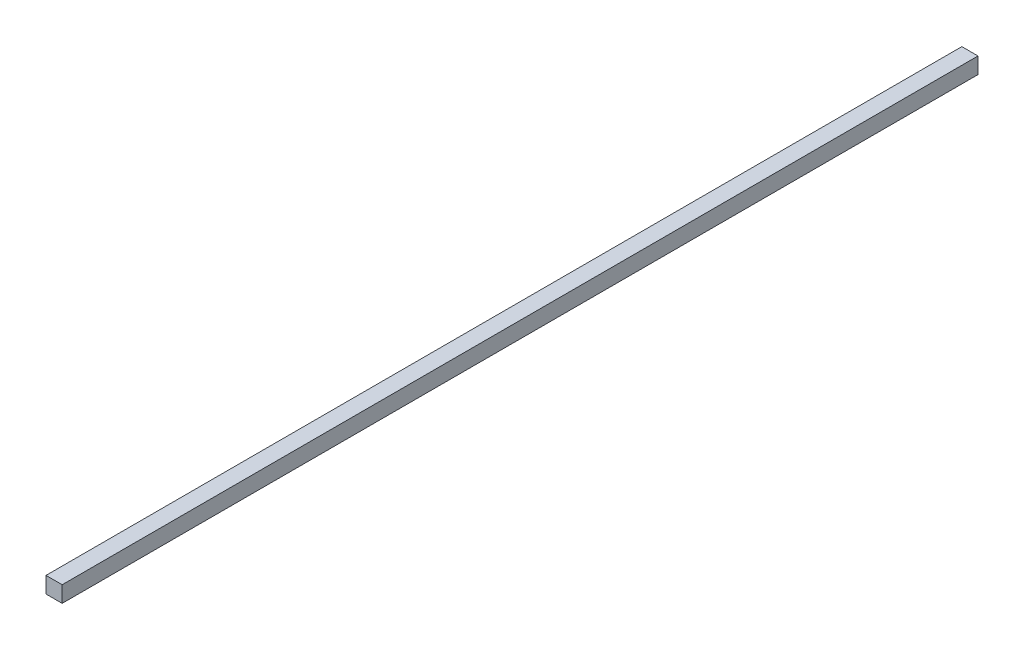
ISO-10303-21;
HEADER;
FILE_DESCRIPTION(('STEP AP214'),'2;1');
FILE_NAME('part.step','',(''),(''),'','','');
FILE_SCHEMA(('AUTOMOTIVE_DESIGN { 1 0 10303 214 1 1 1 1 }'));
ENDSEC;
DATA;
#1=APPLICATION_CONTEXT('core data for automotive mechanical design processes');
#2=APPLICATION_PROTOCOL_DEFINITION('international standard','automotive_design',2000,#1);
#3=PRODUCT_CONTEXT('',#1,'mechanical');
#4=PRODUCT('Part','Part','',(#3));
#5=PRODUCT_RELATED_PRODUCT_CATEGORY('part','',(#4));
#6=PRODUCT_DEFINITION_FORMATION('','',#4);
#7=PRODUCT_DEFINITION_CONTEXT('part definition',#1,'design');
#8=PRODUCT_DEFINITION('design','',#6,#7);
#9=PRODUCT_DEFINITION_SHAPE('','',#8);
#10=(LENGTH_UNIT() NAMED_UNIT(*) SI_UNIT(.MILLI.,.METRE.));
#11=(NAMED_UNIT(*) PLANE_ANGLE_UNIT() SI_UNIT($,.RADIAN.));
#12=(NAMED_UNIT(*) SI_UNIT($,.STERADIAN.) SOLID_ANGLE_UNIT());
#13=UNCERTAINTY_MEASURE_WITH_UNIT(LENGTH_MEASURE(1.E-05),#10,'distance_accuracy_value','');
#14=(GEOMETRIC_REPRESENTATION_CONTEXT(3) GLOBAL_UNCERTAINTY_ASSIGNED_CONTEXT((#13)) GLOBAL_UNIT_ASSIGNED_CONTEXT((#10,
#11,#12)) REPRESENTATION_CONTEXT('',''));
#15=CARTESIAN_POINT('',(0.,0.,0.));
#16=DIRECTION('',(0.,0.,1.));
#17=DIRECTION('',(1.,0.,0.));
#18=AXIS2_PLACEMENT_3D('',#15,#16,#17);
#19=CARTESIAN_POINT('',(0.,0.,850.));
#20=DIRECTION('',(1.,0.,0.));
#21=DIRECTION('',(0.,0.,-1.));
#22=AXIS2_PLACEMENT_3D('',#19,#20,#21);
#23=PLANE('',#22);
#24=DIRECTION('',(0.,-1.,0.));
#25=VECTOR('',#24,1.);
#26=CARTESIAN_POINT('',(0.,0.,0.));
#27=LINE('',#26,#25);
#28=CARTESIAN_POINT('',(0.,15.,0.));
#29=VERTEX_POINT('',#28);
#30=CARTESIAN_POINT('',(0.,0.,0.));
#31=VERTEX_POINT('',#30);
#32=EDGE_CURVE('E97',#29,#31,#27,.T.);
#33=ORIENTED_EDGE('',*,*,#32,.T.);
#34=DIRECTION('',(0.,0.,-1.));
#35=VECTOR('',#34,1.);
#36=CARTESIAN_POINT('',(0.,0.,850.));
#37=LINE('',#36,#35);
#38=CARTESIAN_POINT('',(0.,0.,850.));
#39=VERTEX_POINT('',#38);
#40=EDGE_CURVE('E11',#39,#31,#37,.T.);
#41=ORIENTED_EDGE('',*,*,#40,.F.);
#42=DIRECTION('',(0.,-1.,0.));
#43=VECTOR('',#42,1.);
#44=CARTESIAN_POINT('',(0.,0.,850.));
#45=LINE('',#44,#43);
#46=CARTESIAN_POINT('',(0.,15.,850.));
#47=VERTEX_POINT('',#46);
#48=EDGE_CURVE('E85',#47,#39,#45,.T.);
#49=ORIENTED_EDGE('',*,*,#48,.F.);
#50=DIRECTION('',(0.,0.,-1.));
#51=VECTOR('',#50,1.);
#52=CARTESIAN_POINT('',(0.,15.,850.));
#53=LINE('',#52,#51);
#54=EDGE_CURVE('E93',#47,#29,#53,.T.);
#55=ORIENTED_EDGE('',*,*,#54,.T.);
#56=EDGE_LOOP('',(#33,#41,#49,#55));
#57=FACE_BOUND('',#56,.T.);
#58=ADVANCED_FACE('F34',(#57),#23,.F.);
#59=CARTESIAN_POINT('',(0.,0.,850.));
#60=DIRECTION('',(0.,1.,0.));
#61=DIRECTION('',(0.,0.,1.));
#62=AXIS2_PLACEMENT_3D('',#59,#60,#61);
#63=PLANE('',#62);
#64=DIRECTION('',(1.,0.,0.));
#65=VECTOR('',#64,1.);
#66=CARTESIAN_POINT('',(0.,0.,0.));
#67=LINE('',#66,#65);
#68=CARTESIAN_POINT('',(15.,0.,0.));
#69=VERTEX_POINT('',#68);
#70=EDGE_CURVE('E89',#31,#69,#67,.T.);
#71=ORIENTED_EDGE('',*,*,#70,.T.);
#72=DIRECTION('',(0.,0.,-1.));
#73=VECTOR('',#72,1.);
#74=CARTESIAN_POINT('',(15.,0.,850.));
#75=LINE('',#74,#73);
#76=CARTESIAN_POINT('',(15.,0.,850.));
#77=VERTEX_POINT('',#76);
#78=EDGE_CURVE('E42',#77,#69,#75,.T.);
#79=ORIENTED_EDGE('',*,*,#78,.F.);
#80=DIRECTION('',(1.,0.,0.));
#81=VECTOR('',#80,1.);
#82=CARTESIAN_POINT('',(0.,0.,850.));
#83=LINE('',#82,#81);
#84=EDGE_CURVE('E80',#39,#77,#83,.T.);
#85=ORIENTED_EDGE('',*,*,#84,.F.);
#86=ORIENTED_EDGE('',*,*,#40,.T.);
#87=EDGE_LOOP('',(#71,#79,#85,#86));
#88=FACE_BOUND('',#87,.T.);
#89=ADVANCED_FACE('F88',(#88),#63,.F.);
#90=CARTESIAN_POINT('',(15.,0.,850.));
#91=DIRECTION('',(-1.,0.,0.));
#92=DIRECTION('',(0.,0.,1.));
#93=AXIS2_PLACEMENT_3D('',#90,#91,#92);
#94=PLANE('',#93);
#95=DIRECTION('',(0.,1.,0.));
#96=VECTOR('',#95,1.);
#97=CARTESIAN_POINT('',(15.,0.,0.));
#98=LINE('',#97,#96);
#99=CARTESIAN_POINT('',(15.,15.,0.));
#100=VERTEX_POINT('',#99);
#101=EDGE_CURVE('E67',#69,#100,#98,.T.);
#102=ORIENTED_EDGE('',*,*,#101,.T.);
#103=DIRECTION('',(0.,0.,-1.));
#104=VECTOR('',#103,1.);
#105=CARTESIAN_POINT('',(15.,15.,850.));
#106=LINE('',#105,#104);
#107=CARTESIAN_POINT('',(15.,15.,850.));
#108=VERTEX_POINT('',#107);
#109=EDGE_CURVE('E90',#108,#100,#106,.T.);
#110=ORIENTED_EDGE('',*,*,#109,.F.);
#111=DIRECTION('',(0.,1.,0.));
#112=VECTOR('',#111,1.);
#113=CARTESIAN_POINT('',(15.,0.,850.));
#114=LINE('',#113,#112);
#115=EDGE_CURVE('E83',#77,#108,#114,.T.);
#116=ORIENTED_EDGE('',*,*,#115,.F.);
#117=ORIENTED_EDGE('',*,*,#78,.T.);
#118=EDGE_LOOP('',(#102,#110,#116,#117));
#119=FACE_BOUND('',#118,.T.);
#120=ADVANCED_FACE('F91',(#119),#94,.F.);
#121=CARTESIAN_POINT('',(0.,15.,850.));
#122=DIRECTION('',(0.,-1.,0.));
#123=DIRECTION('',(0.,0.,-1.));
#124=AXIS2_PLACEMENT_3D('',#121,#122,#123);
#125=PLANE('',#124);
#126=DIRECTION('',(-1.,0.,0.));
#127=VECTOR('',#126,1.);
#128=CARTESIAN_POINT('',(0.,15.,0.));
#129=LINE('',#128,#127);
#130=EDGE_CURVE('E73',#100,#29,#129,.T.);
#131=ORIENTED_EDGE('',*,*,#130,.T.);
#132=ORIENTED_EDGE('',*,*,#54,.F.);
#133=DIRECTION('',(-1.,0.,0.));
#134=VECTOR('',#133,1.);
#135=CARTESIAN_POINT('',(0.,15.,850.));
#136=LINE('',#135,#134);
#137=EDGE_CURVE('E50',#108,#47,#136,.T.);
#138=ORIENTED_EDGE('',*,*,#137,.F.);
#139=ORIENTED_EDGE('',*,*,#109,.T.);
#140=EDGE_LOOP('',(#131,#132,#138,#139));
#141=FACE_BOUND('',#140,.T.);
#142=ADVANCED_FACE('F104',(#141),#125,.F.);
#143=CARTESIAN_POINT('',(0.,0.,850.));
#144=DIRECTION('',(0.,0.,-1.));
#145=DIRECTION('',(-1.,0.,0.));
#146=AXIS2_PLACEMENT_3D('',#143,#144,#145);
#147=PLANE('',#146);
#148=ORIENTED_EDGE('',*,*,#48,.T.);
#149=ORIENTED_EDGE('',*,*,#84,.T.);
#150=ORIENTED_EDGE('',*,*,#115,.T.);
#151=ORIENTED_EDGE('',*,*,#137,.T.);
#152=EDGE_LOOP('',(#148,#149,#150,#151));
#153=FACE_BOUND('',#152,.T.);
#154=ADVANCED_FACE('F81',(#153),#147,.F.);
#155=CARTESIAN_POINT('',(0.,0.,0.));
#156=DIRECTION('',(0.,0.,-1.));
#157=DIRECTION('',(-1.,0.,0.));
#158=AXIS2_PLACEMENT_3D('',#155,#156,#157);
#159=PLANE('',#158);
#160=ORIENTED_EDGE('',*,*,#32,.F.);
#161=ORIENTED_EDGE('',*,*,#130,.F.);
#162=ORIENTED_EDGE('',*,*,#101,.F.);
#163=ORIENTED_EDGE('',*,*,#70,.F.);
#164=EDGE_LOOP('',(#160,#161,#162,#163));
#165=FACE_BOUND('',#164,.T.);
#166=ADVANCED_FACE('F107',(#165),#159,.T.);
#167=CLOSED_SHELL('',(#58,#89,#120,#142,#154,#166));
#168=MANIFOLD_SOLID_BREP('B2',#167);
#169=ADVANCED_BREP_SHAPE_REPRESENTATION('',(#18,#168),#14);
#170=SHAPE_DEFINITION_REPRESENTATION(#9,#169);
ENDSEC;
END-ISO-10303-21;
